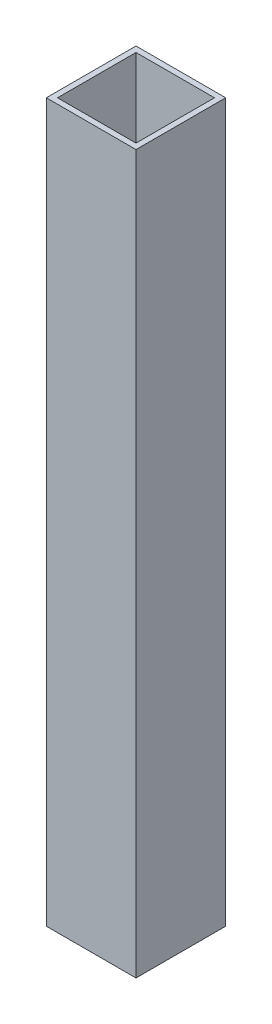
ISO-10303-21;
HEADER;
FILE_DESCRIPTION(('STEP AP214'),'2;1');
FILE_NAME('part.step','',(''),(''),'','','');
FILE_SCHEMA(('AUTOMOTIVE_DESIGN { 1 0 10303 214 1 1 1 1 }'));
ENDSEC;
DATA;
#1=APPLICATION_CONTEXT('core data for automotive mechanical design processes');
#2=APPLICATION_PROTOCOL_DEFINITION('international standard','automotive_design',2000,#1);
#3=PRODUCT_CONTEXT('',#1,'mechanical');
#4=PRODUCT('Part','Part','',(#3));
#5=PRODUCT_RELATED_PRODUCT_CATEGORY('part','',(#4));
#6=PRODUCT_DEFINITION_FORMATION('','',#4);
#7=PRODUCT_DEFINITION_CONTEXT('part definition',#1,'design');
#8=PRODUCT_DEFINITION('design','',#6,#7);
#9=PRODUCT_DEFINITION_SHAPE('','',#8);
#10=(LENGTH_UNIT() NAMED_UNIT(*) SI_UNIT(.MILLI.,.METRE.));
#11=(NAMED_UNIT(*) PLANE_ANGLE_UNIT() SI_UNIT($,.RADIAN.));
#12=(NAMED_UNIT(*) SI_UNIT($,.STERADIAN.) SOLID_ANGLE_UNIT());
#13=UNCERTAINTY_MEASURE_WITH_UNIT(LENGTH_MEASURE(1.E-05),#10,'distance_accuracy_value','');
#14=(GEOMETRIC_REPRESENTATION_CONTEXT(3) GLOBAL_UNCERTAINTY_ASSIGNED_CONTEXT((#13)) GLOBAL_UNIT_ASSIGNED_CONTEXT((#10,
#11,#12)) REPRESENTATION_CONTEXT('',''));
#15=CARTESIAN_POINT('',(0.,0.,0.));
#16=DIRECTION('',(0.,0.,1.));
#17=DIRECTION('',(1.,0.,0.));
#18=AXIS2_PLACEMENT_3D('',#15,#16,#17);
#19=CARTESIAN_POINT('',(0.,203.2,0.));
#20=DIRECTION('',(0.,1.,0.));
#21=DIRECTION('',(0.,0.,1.));
#22=AXIS2_PLACEMENT_3D('',#19,#20,#21);
#23=PLANE('',#22);
#24=DIRECTION('',(0.,0.,1.));
#25=VECTOR('',#24,1.);
#26=CARTESIAN_POINT('',(-12.7,203.2,12.7));
#27=LINE('',#26,#25);
#28=CARTESIAN_POINT('',(-12.7,203.2,-12.7));
#29=VERTEX_POINT('',#28);
#30=CARTESIAN_POINT('',(-12.7,203.2,12.7));
#31=VERTEX_POINT('',#30);
#32=EDGE_CURVE('E136',#29,#31,#27,.T.);
#33=ORIENTED_EDGE('',*,*,#32,.T.);
#34=DIRECTION('',(1.,0.,0.));
#35=VECTOR('',#34,1.);
#36=CARTESIAN_POINT('',(12.7,203.2,12.7));
#37=LINE('',#36,#35);
#38=CARTESIAN_POINT('',(12.7,203.2,12.7));
#39=VERTEX_POINT('',#38);
#40=EDGE_CURVE('E139',#31,#39,#37,.T.);
#41=ORIENTED_EDGE('',*,*,#40,.T.);
#42=DIRECTION('',(0.,0.,-1.));
#43=VECTOR('',#42,1.);
#44=CARTESIAN_POINT('',(12.7,203.2,12.7));
#45=LINE('',#44,#43);
#46=CARTESIAN_POINT('',(12.7,203.2,-12.7));
#47=VERTEX_POINT('',#46);
#48=EDGE_CURVE('E142',#39,#47,#45,.T.);
#49=ORIENTED_EDGE('',*,*,#48,.T.);
#50=DIRECTION('',(-1.,0.,0.));
#51=VECTOR('',#50,1.);
#52=CARTESIAN_POINT('',(12.7,203.2,-12.7));
#53=LINE('',#52,#51);
#54=EDGE_CURVE('E144',#47,#29,#53,.T.);
#55=ORIENTED_EDGE('',*,*,#54,.T.);
#56=EDGE_LOOP('',(#33,#41,#49,#55));
#57=FACE_BOUND('',#56,.T.);
#58=DIRECTION('',(1.,0.,0.));
#59=VECTOR('',#58,1.);
#60=CARTESIAN_POINT('',(11.1125,203.2,11.1125));
#61=LINE('',#60,#59);
#62=CARTESIAN_POINT('',(-11.1125,203.2,11.1125));
#63=VERTEX_POINT('',#62);
#64=CARTESIAN_POINT('',(11.1125,203.2,11.1125));
#65=VERTEX_POINT('',#64);
#66=EDGE_CURVE('E108',#63,#65,#61,.T.);
#67=ORIENTED_EDGE('',*,*,#66,.F.);
#68=DIRECTION('',(0.,0.,1.));
#69=VECTOR('',#68,1.);
#70=CARTESIAN_POINT('',(-11.1125,203.2,11.1125));
#71=LINE('',#70,#69);
#72=CARTESIAN_POINT('',(-11.1125,203.2,-11.1125));
#73=VERTEX_POINT('',#72);
#74=EDGE_CURVE('E100',#73,#63,#71,.T.);
#75=ORIENTED_EDGE('',*,*,#74,.F.);
#76=DIRECTION('',(-1.,0.,0.));
#77=VECTOR('',#76,1.);
#78=CARTESIAN_POINT('',(11.1125,203.2,-11.1125));
#79=LINE('',#78,#77);
#80=CARTESIAN_POINT('',(11.1125,203.2,-11.1125));
#81=VERTEX_POINT('',#80);
#82=EDGE_CURVE('E122',#81,#73,#79,.T.);
#83=ORIENTED_EDGE('',*,*,#82,.F.);
#84=DIRECTION('',(0.,0.,-1.));
#85=VECTOR('',#84,1.);
#86=CARTESIAN_POINT('',(11.1125,203.2,11.1125));
#87=LINE('',#86,#85);
#88=EDGE_CURVE('E120',#65,#81,#87,.T.);
#89=ORIENTED_EDGE('',*,*,#88,.F.);
#90=EDGE_LOOP('',(#67,#75,#83,#89));
#91=FACE_BOUND('',#90,.T.);
#92=ADVANCED_FACE('F35',(#57,#91),#23,.T.);
#93=CARTESIAN_POINT('',(0.,0.,0.));
#94=DIRECTION('',(0.,1.,0.));
#95=DIRECTION('',(0.,0.,1.));
#96=AXIS2_PLACEMENT_3D('',#93,#94,#95);
#97=PLANE('',#96);
#98=DIRECTION('',(0.,0.,1.));
#99=VECTOR('',#98,1.);
#100=CARTESIAN_POINT('',(-12.7,0.,12.7));
#101=LINE('',#100,#99);
#102=CARTESIAN_POINT('',(-12.7,0.,-12.7));
#103=VERTEX_POINT('',#102);
#104=CARTESIAN_POINT('',(-12.7,0.,12.7));
#105=VERTEX_POINT('',#104);
#106=EDGE_CURVE('E116',#103,#105,#101,.T.);
#107=ORIENTED_EDGE('',*,*,#106,.F.);
#108=DIRECTION('',(-1.,0.,0.));
#109=VECTOR('',#108,1.);
#110=CARTESIAN_POINT('',(12.7,0.,-12.7));
#111=LINE('',#110,#109);
#112=CARTESIAN_POINT('',(12.7,0.,-12.7));
#113=VERTEX_POINT('',#112);
#114=EDGE_CURVE('E140',#113,#103,#111,.T.);
#115=ORIENTED_EDGE('',*,*,#114,.F.);
#116=DIRECTION('',(0.,0.,-1.));
#117=VECTOR('',#116,1.);
#118=CARTESIAN_POINT('',(12.7,0.,12.7));
#119=LINE('',#118,#117);
#120=CARTESIAN_POINT('',(12.7,0.,12.7));
#121=VERTEX_POINT('',#120);
#122=EDGE_CURVE('E151',#121,#113,#119,.T.);
#123=ORIENTED_EDGE('',*,*,#122,.F.);
#124=DIRECTION('',(1.,0.,0.));
#125=VECTOR('',#124,1.);
#126=CARTESIAN_POINT('',(12.7,0.,12.7));
#127=LINE('',#126,#125);
#128=EDGE_CURVE('E149',#105,#121,#127,.T.);
#129=ORIENTED_EDGE('',*,*,#128,.F.);
#130=EDGE_LOOP('',(#107,#115,#123,#129));
#131=FACE_BOUND('',#130,.T.);
#132=DIRECTION('',(0.,0.,1.));
#133=VECTOR('',#132,1.);
#134=CARTESIAN_POINT('',(-11.1125,0.,11.1125));
#135=LINE('',#134,#133);
#136=CARTESIAN_POINT('',(-11.1125,0.,-11.1125));
#137=VERTEX_POINT('',#136);
#138=CARTESIAN_POINT('',(-11.1125,0.,11.1125));
#139=VERTEX_POINT('',#138);
#140=EDGE_CURVE('E58',#137,#139,#135,.T.);
#141=ORIENTED_EDGE('',*,*,#140,.T.);
#142=DIRECTION('',(1.,0.,0.));
#143=VECTOR('',#142,1.);
#144=CARTESIAN_POINT('',(11.1125,0.,11.1125));
#145=LINE('',#144,#143);
#146=CARTESIAN_POINT('',(11.1125,0.,11.1125));
#147=VERTEX_POINT('',#146);
#148=EDGE_CURVE('E115',#139,#147,#145,.T.);
#149=ORIENTED_EDGE('',*,*,#148,.T.);
#150=DIRECTION('',(0.,0.,-1.));
#151=VECTOR('',#150,1.);
#152=CARTESIAN_POINT('',(11.1125,0.,11.1125));
#153=LINE('',#152,#151);
#154=CARTESIAN_POINT('',(11.1125,0.,-11.1125));
#155=VERTEX_POINT('',#154);
#156=EDGE_CURVE('E128',#147,#155,#153,.T.);
#157=ORIENTED_EDGE('',*,*,#156,.T.);
#158=DIRECTION('',(-1.,0.,0.));
#159=VECTOR('',#158,1.);
#160=CARTESIAN_POINT('',(11.1125,0.,-11.1125));
#161=LINE('',#160,#159);
#162=EDGE_CURVE('E109',#155,#137,#161,.T.);
#163=ORIENTED_EDGE('',*,*,#162,.T.);
#164=EDGE_LOOP('',(#141,#149,#157,#163));
#165=FACE_BOUND('',#164,.T.);
#166=ADVANCED_FACE('F169',(#131,#165),#97,.F.);
#167=CARTESIAN_POINT('',(-12.7,203.2,12.7));
#168=DIRECTION('',(1.,0.,0.));
#169=DIRECTION('',(0.,0.,-1.));
#170=AXIS2_PLACEMENT_3D('',#167,#168,#169);
#171=PLANE('',#170);
#172=ORIENTED_EDGE('',*,*,#106,.T.);
#173=DIRECTION('',(0.,-1.,0.));
#174=VECTOR('',#173,1.);
#175=CARTESIAN_POINT('',(-12.7,203.2,12.7));
#176=LINE('',#175,#174);
#177=EDGE_CURVE('E11',#31,#105,#176,.T.);
#178=ORIENTED_EDGE('',*,*,#177,.F.);
#179=ORIENTED_EDGE('',*,*,#32,.F.);
#180=DIRECTION('',(0.,-1.,0.));
#181=VECTOR('',#180,1.);
#182=CARTESIAN_POINT('',(-12.7,203.2,-12.7));
#183=LINE('',#182,#181);
#184=EDGE_CURVE('E146',#29,#103,#183,.T.);
#185=ORIENTED_EDGE('',*,*,#184,.T.);
#186=EDGE_LOOP('',(#172,#178,#179,#185));
#187=FACE_BOUND('',#186,.T.);
#188=ADVANCED_FACE('F37',(#187),#171,.F.);
#189=CARTESIAN_POINT('',(12.7,203.2,12.7));
#190=DIRECTION('',(0.,0.,-1.));
#191=DIRECTION('',(-1.,0.,0.));
#192=AXIS2_PLACEMENT_3D('',#189,#190,#191);
#193=PLANE('',#192);
#194=ORIENTED_EDGE('',*,*,#128,.T.);
#195=DIRECTION('',(0.,-1.,0.));
#196=VECTOR('',#195,1.);
#197=CARTESIAN_POINT('',(12.7,203.2,12.7));
#198=LINE('',#197,#196);
#199=EDGE_CURVE('E43',#39,#121,#198,.T.);
#200=ORIENTED_EDGE('',*,*,#199,.F.);
#201=ORIENTED_EDGE('',*,*,#40,.F.);
#202=ORIENTED_EDGE('',*,*,#177,.T.);
#203=EDGE_LOOP('',(#194,#200,#201,#202));
#204=FACE_BOUND('',#203,.T.);
#205=ADVANCED_FACE('F179',(#204),#193,.F.);
#206=CARTESIAN_POINT('',(12.7,203.2,12.7));
#207=DIRECTION('',(-1.,0.,0.));
#208=DIRECTION('',(0.,0.,1.));
#209=AXIS2_PLACEMENT_3D('',#206,#207,#208);
#210=PLANE('',#209);
#211=ORIENTED_EDGE('',*,*,#122,.T.);
#212=DIRECTION('',(0.,-1.,0.));
#213=VECTOR('',#212,1.);
#214=CARTESIAN_POINT('',(12.7,203.2,-12.7));
#215=LINE('',#214,#213);
#216=EDGE_CURVE('E156',#47,#113,#215,.T.);
#217=ORIENTED_EDGE('',*,*,#216,.F.);
#218=ORIENTED_EDGE('',*,*,#48,.F.);
#219=ORIENTED_EDGE('',*,*,#199,.T.);
#220=EDGE_LOOP('',(#211,#217,#218,#219));
#221=FACE_BOUND('',#220,.T.);
#222=ADVANCED_FACE('F163',(#221),#210,.F.);
#223=CARTESIAN_POINT('',(12.7,203.2,-12.7));
#224=DIRECTION('',(0.,0.,1.));
#225=DIRECTION('',(1.,0.,0.));
#226=AXIS2_PLACEMENT_3D('',#223,#224,#225);
#227=PLANE('',#226);
#228=ORIENTED_EDGE('',*,*,#114,.T.);
#229=ORIENTED_EDGE('',*,*,#184,.F.);
#230=ORIENTED_EDGE('',*,*,#54,.F.);
#231=ORIENTED_EDGE('',*,*,#216,.T.);
#232=EDGE_LOOP('',(#228,#229,#230,#231));
#233=FACE_BOUND('',#232,.T.);
#234=ADVANCED_FACE('F173',(#233),#227,.F.);
#235=CARTESIAN_POINT('',(-11.1125,203.2,11.1125));
#236=DIRECTION('',(1.,0.,0.));
#237=DIRECTION('',(0.,0.,-1.));
#238=AXIS2_PLACEMENT_3D('',#235,#236,#237);
#239=PLANE('',#238);
#240=ORIENTED_EDGE('',*,*,#140,.F.);
#241=DIRECTION('',(0.,-1.,0.));
#242=VECTOR('',#241,1.);
#243=CARTESIAN_POINT('',(-11.1125,203.2,-11.1125));
#244=LINE('',#243,#242);
#245=EDGE_CURVE('E104',#73,#137,#244,.T.);
#246=ORIENTED_EDGE('',*,*,#245,.F.);
#247=ORIENTED_EDGE('',*,*,#74,.T.);
#248=DIRECTION('',(0.,-1.,0.));
#249=VECTOR('',#248,1.);
#250=CARTESIAN_POINT('',(-11.1125,203.2,11.1125));
#251=LINE('',#250,#249);
#252=EDGE_CURVE('E103',#63,#139,#251,.T.);
#253=ORIENTED_EDGE('',*,*,#252,.T.);
#254=EDGE_LOOP('',(#240,#246,#247,#253));
#255=FACE_BOUND('',#254,.T.);
#256=ADVANCED_FACE('F102',(#255),#239,.T.);
#257=CARTESIAN_POINT('',(11.1125,203.2,11.1125));
#258=DIRECTION('',(0.,0.,-1.));
#259=DIRECTION('',(-1.,0.,0.));
#260=AXIS2_PLACEMENT_3D('',#257,#258,#259);
#261=PLANE('',#260);
#262=ORIENTED_EDGE('',*,*,#148,.F.);
#263=ORIENTED_EDGE('',*,*,#252,.F.);
#264=ORIENTED_EDGE('',*,*,#66,.T.);
#265=DIRECTION('',(0.,-1.,0.));
#266=VECTOR('',#265,1.);
#267=CARTESIAN_POINT('',(11.1125,203.2,11.1125));
#268=LINE('',#267,#266);
#269=EDGE_CURVE('E117',#65,#147,#268,.T.);
#270=ORIENTED_EDGE('',*,*,#269,.T.);
#271=EDGE_LOOP('',(#262,#263,#264,#270));
#272=FACE_BOUND('',#271,.T.);
#273=ADVANCED_FACE('F112',(#272),#261,.T.);
#274=CARTESIAN_POINT('',(11.1125,203.2,11.1125));
#275=DIRECTION('',(-1.,0.,0.));
#276=DIRECTION('',(0.,0.,1.));
#277=AXIS2_PLACEMENT_3D('',#274,#275,#276);
#278=PLANE('',#277);
#279=ORIENTED_EDGE('',*,*,#156,.F.);
#280=ORIENTED_EDGE('',*,*,#269,.F.);
#281=ORIENTED_EDGE('',*,*,#88,.T.);
#282=DIRECTION('',(0.,-1.,0.));
#283=VECTOR('',#282,1.);
#284=CARTESIAN_POINT('',(11.1125,203.2,-11.1125));
#285=LINE('',#284,#283);
#286=EDGE_CURVE('E50',#81,#155,#285,.T.);
#287=ORIENTED_EDGE('',*,*,#286,.T.);
#288=EDGE_LOOP('',(#279,#280,#281,#287));
#289=FACE_BOUND('',#288,.T.);
#290=ADVANCED_FACE('F202',(#289),#278,.T.);
#291=CARTESIAN_POINT('',(11.1125,203.2,-11.1125));
#292=DIRECTION('',(0.,0.,1.));
#293=DIRECTION('',(1.,0.,0.));
#294=AXIS2_PLACEMENT_3D('',#291,#292,#293);
#295=PLANE('',#294);
#296=ORIENTED_EDGE('',*,*,#162,.F.);
#297=ORIENTED_EDGE('',*,*,#286,.F.);
#298=ORIENTED_EDGE('',*,*,#82,.T.);
#299=ORIENTED_EDGE('',*,*,#245,.T.);
#300=EDGE_LOOP('',(#296,#297,#298,#299));
#301=FACE_BOUND('',#300,.T.);
#302=ADVANCED_FACE('F206',(#301),#295,.T.);
#303=CLOSED_SHELL('',(#92,#166,#188,#205,#222,#234,#256,#273,#290,#302));
#304=MANIFOLD_SOLID_BREP('B2',#303);
#305=ADVANCED_BREP_SHAPE_REPRESENTATION('',(#18,#304),#14);
#306=SHAPE_DEFINITION_REPRESENTATION(#9,#305);
ENDSEC;
END-ISO-10303-21;
